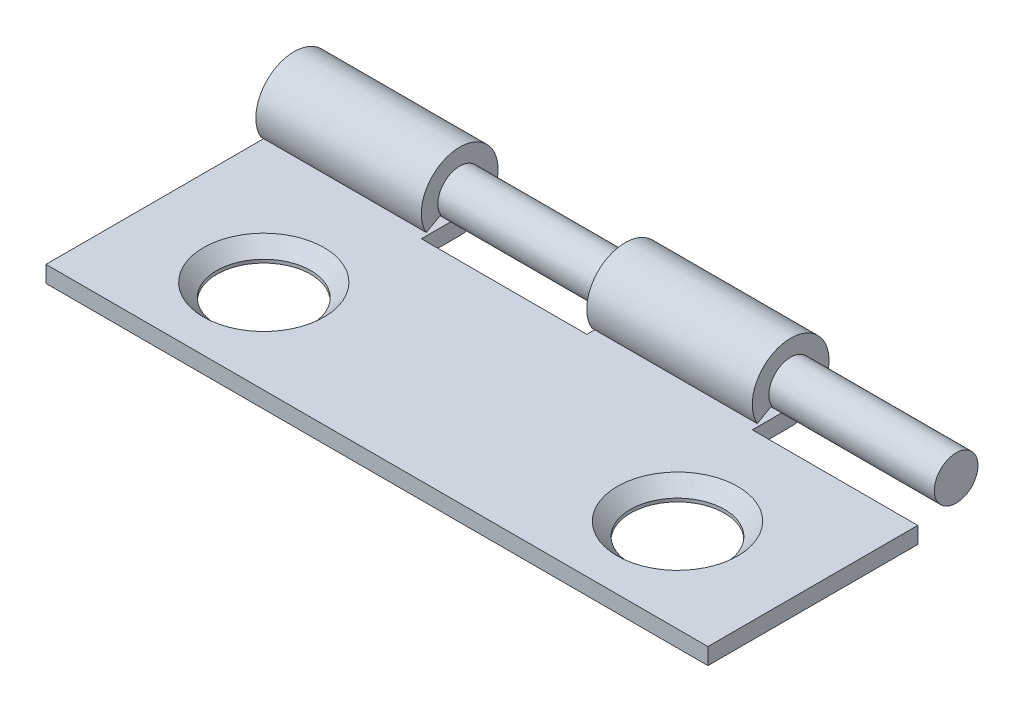
ISO-10303-21;
HEADER;
FILE_DESCRIPTION(('STEP AP214'),'2;1');
FILE_NAME('part.step','',(''),(''),'','','');
FILE_SCHEMA(('AUTOMOTIVE_DESIGN { 1 0 10303 214 1 1 1 1 }'));
ENDSEC;
DATA;
#1=APPLICATION_CONTEXT('core data for automotive mechanical design processes');
#2=APPLICATION_PROTOCOL_DEFINITION('international standard','automotive_design',2000,#1);
#3=PRODUCT_CONTEXT('',#1,'mechanical');
#4=PRODUCT('Part','Part','',(#3));
#5=PRODUCT_RELATED_PRODUCT_CATEGORY('part','',(#4));
#6=PRODUCT_DEFINITION_FORMATION('','',#4);
#7=PRODUCT_DEFINITION_CONTEXT('part definition',#1,'design');
#8=PRODUCT_DEFINITION('design','',#6,#7);
#9=PRODUCT_DEFINITION_SHAPE('','',#8);
#10=(LENGTH_UNIT() NAMED_UNIT(*) SI_UNIT(.MILLI.,.METRE.));
#11=(NAMED_UNIT(*) PLANE_ANGLE_UNIT() SI_UNIT($,.RADIAN.));
#12=(NAMED_UNIT(*) SI_UNIT($,.STERADIAN.) SOLID_ANGLE_UNIT());
#13=UNCERTAINTY_MEASURE_WITH_UNIT(LENGTH_MEASURE(1.E-05),#10,'distance_accuracy_value','');
#14=(GEOMETRIC_REPRESENTATION_CONTEXT(3) GLOBAL_UNCERTAINTY_ASSIGNED_CONTEXT((#13)) GLOBAL_UNIT_ASSIGNED_CONTEXT((#10,
#11,#12)) REPRESENTATION_CONTEXT('',''));
#15=CARTESIAN_POINT('',(0.,0.,0.));
#16=DIRECTION('',(0.,0.,1.));
#17=DIRECTION('',(1.,0.,0.));
#18=AXIS2_PLACEMENT_3D('',#15,#16,#17);
#19=CARTESIAN_POINT('',(12.7,0.,0.));
#20=DIRECTION('',(-1.,0.,0.));
#21=DIRECTION('',(0.,0.,1.));
#22=AXIS2_PLACEMENT_3D('',#19,#20,#21);
#23=CYLINDRICAL_SURFACE('',#22,0.8382);
#24=CARTESIAN_POINT('',(12.7,0.,0.));
#25=DIRECTION('',(1.,0.,0.));
#26=DIRECTION('',(0.,0.,-1.));
#27=AXIS2_PLACEMENT_3D('',#24,#25,#26);
#28=CIRCLE('',#27,0.8382);
#29=CARTESIAN_POINT('',(12.7,0.,-0.8382));
#30=VERTEX_POINT('',#29);
#31=EDGE_CURVE('E11',#30,#30,#28,.T.);
#32=ORIENTED_EDGE('',*,*,#31,.F.);
#33=EDGE_LOOP('',(#32));
#34=FACE_BOUND('',#33,.T.);
#35=CARTESIAN_POINT('',(-12.7,0.,0.));
#36=DIRECTION('',(1.,0.,0.));
#37=DIRECTION('',(0.,0.,-1.));
#38=AXIS2_PLACEMENT_3D('',#35,#36,#37);
#39=CIRCLE('',#38,0.8382);
#40=CARTESIAN_POINT('',(-12.7,0.,-0.8382));
#41=VERTEX_POINT('',#40);
#42=EDGE_CURVE('E49',#41,#41,#39,.T.);
#43=ORIENTED_EDGE('',*,*,#42,.T.);
#44=EDGE_LOOP('',(#43));
#45=FACE_BOUND('',#44,.T.);
#46=ADVANCED_FACE('F46',(#34,#45),#23,.T.);
#47=CARTESIAN_POINT('',(12.7,0.,0.));
#48=DIRECTION('',(1.,0.,0.));
#49=DIRECTION('',(0.,0.,-1.));
#50=AXIS2_PLACEMENT_3D('',#47,#48,#49);
#51=PLANE('',#50);
#52=ORIENTED_EDGE('',*,*,#31,.T.);
#53=EDGE_LOOP('',(#52));
#54=FACE_BOUND('',#53,.T.);
#55=ADVANCED_FACE('F61',(#54),#51,.T.);
#56=CARTESIAN_POINT('',(-12.7,0.,0.));
#57=DIRECTION('',(1.,0.,0.));
#58=DIRECTION('',(0.,0.,-1.));
#59=AXIS2_PLACEMENT_3D('',#56,#57,#58);
#60=PLANE('',#59);
#61=ORIENTED_EDGE('',*,*,#42,.F.);
#62=EDGE_LOOP('',(#61));
#63=FACE_BOUND('',#62,.T.);
#64=ADVANCED_FACE('F59',(#63),#60,.F.);
#65=CLOSED_SHELL('',(#46,#55,#64));
#66=MANIFOLD_SOLID_BREP('B2',#65);
#67=CARTESIAN_POINT('',(12.7,0.,0.));
#68=DIRECTION('',(-1.,0.,0.));
#69=DIRECTION('',(0.,0.,1.));
#70=AXIS2_PLACEMENT_3D('',#67,#68,#69);
#71=CYLINDRICAL_SURFACE('',#70,1.47320000000008);
#72=CARTESIAN_POINT('',(6.35,0.,0.));
#73=DIRECTION('',(-1.,0.,0.));
#74=DIRECTION('',(0.,0.,1.));
#75=AXIS2_PLACEMENT_3D('',#72,#73,#74);
#76=CIRCLE('',#75,1.47320000000008);
#77=CARTESIAN_POINT('',(6.35,-0.728533124002553,1.28045215733782));
#78=VERTEX_POINT('',#77);
#79=CARTESIAN_POINT('',(6.35,-1.4732,0.));
#80=VERTEX_POINT('',#79);
#81=EDGE_CURVE('E225',#78,#80,#76,.T.);
#82=ORIENTED_EDGE('',*,*,#81,.T.);
#83=DIRECTION('',(-1.,0.,0.));
#84=VECTOR('',#83,1.);
#85=CARTESIAN_POINT('',(12.7,-1.4732,0.));
#86=LINE('',#85,#84);
#87=CARTESIAN_POINT('',(0.,-1.4732,0.));
#88=VERTEX_POINT('',#87);
#89=EDGE_CURVE('E208',#80,#88,#86,.T.);
#90=ORIENTED_EDGE('',*,*,#89,.T.);
#91=CARTESIAN_POINT('',(0.,0.,0.));
#92=DIRECTION('',(1.,0.,0.));
#93=DIRECTION('',(0.,0.,-1.));
#94=AXIS2_PLACEMENT_3D('',#91,#92,#93);
#95=CIRCLE('',#94,1.47320000000008);
#96=CARTESIAN_POINT('',(0.,-0.728533124002553,1.28045215733782));
#97=VERTEX_POINT('',#96);
#98=EDGE_CURVE('E249',#88,#97,#95,.T.);
#99=ORIENTED_EDGE('',*,*,#98,.T.);
#100=DIRECTION('',(-1.,0.,0.));
#101=VECTOR('',#100,1.);
#102=CARTESIAN_POINT('',(12.7,-0.728533124002553,1.28045215733782));
#103=LINE('',#102,#101);
#104=EDGE_CURVE('E286',#78,#97,#103,.T.);
#105=ORIENTED_EDGE('',*,*,#104,.F.);
#106=EDGE_LOOP('',(#82,#90,#99,#105));
#107=FACE_BOUND('',#106,.T.);
#108=ADVANCED_FACE('F86',(#107),#71,.T.);
#109=CARTESIAN_POINT('',(12.7,0.,0.));
#110=DIRECTION('',(-1.,0.,0.));
#111=DIRECTION('',(0.,0.,1.));
#112=AXIS2_PLACEMENT_3D('',#109,#110,#111);
#113=CYLINDRICAL_SURFACE('',#112,0.8382);
#114=DIRECTION('',(-1.,0.,0.));
#115=VECTOR('',#114,1.);
#116=CARTESIAN_POINT('',(12.7,-0.8382,0.));
#117=LINE('',#116,#115);
#118=CARTESIAN_POINT('',(6.35,-0.8382,0.));
#119=VERTEX_POINT('',#118);
#120=CARTESIAN_POINT('',(0.,-0.8382,0.));
#121=VERTEX_POINT('',#120);
#122=EDGE_CURVE('E297',#119,#121,#117,.T.);
#123=ORIENTED_EDGE('',*,*,#122,.F.);
#124=CARTESIAN_POINT('',(6.35,0.,0.));
#125=DIRECTION('',(-1.,0.,0.));
#126=DIRECTION('',(0.,0.,1.));
#127=AXIS2_PLACEMENT_3D('',#124,#125,#126);
#128=CIRCLE('',#127,0.8382);
#129=CARTESIAN_POINT('',(6.35,-0.414510225725591,0.728533124002553));
#130=VERTEX_POINT('',#129);
#131=EDGE_CURVE('E219',#119,#130,#128,.F.);
#132=ORIENTED_EDGE('',*,*,#131,.T.);
#133=DIRECTION('',(-1.,0.,0.));
#134=VECTOR('',#133,1.);
#135=CARTESIAN_POINT('',(12.7,-0.414510225725591,0.728533124002553));
#136=LINE('',#135,#134);
#137=CARTESIAN_POINT('',(0.,-0.414510225725591,0.728533124002553));
#138=VERTEX_POINT('',#137);
#139=EDGE_CURVE('E283',#130,#138,#136,.T.);
#140=ORIENTED_EDGE('',*,*,#139,.T.);
#141=CARTESIAN_POINT('',(0.,0.,0.));
#142=DIRECTION('',(1.,0.,0.));
#143=DIRECTION('',(0.,0.,-1.));
#144=AXIS2_PLACEMENT_3D('',#141,#142,#143);
#145=CIRCLE('',#144,0.8382);
#146=EDGE_CURVE('E248',#138,#121,#145,.F.);
#147=ORIENTED_EDGE('',*,*,#146,.T.);
#148=EDGE_LOOP('',(#123,#132,#140,#147));
#149=FACE_BOUND('',#148,.T.);
#150=ADVANCED_FACE('F372',(#149),#113,.F.);
#151=CARTESIAN_POINT('',(12.7,-0.414510225725591,0.728533124002553));
#152=DIRECTION('',(0.,0.869163832024044,0.494524249255059));
#153=DIRECTION('',(0.,-0.494524249255059,0.869163832024044));
#154=AXIS2_PLACEMENT_3D('',#151,#152,#153);
#155=PLANE('',#154);
#156=ORIENTED_EDGE('',*,*,#139,.F.);
#157=DIRECTION('',(0.,-0.49452424925506,0.869163832024044));
#158=VECTOR('',#157,1.);
#159=CARTESIAN_POINT('',(6.35,-0.414510225725592,0.728533124002555));
#160=LINE('',#159,#158);
#161=EDGE_CURVE('E222',#130,#78,#160,.T.);
#162=ORIENTED_EDGE('',*,*,#161,.T.);
#163=ORIENTED_EDGE('',*,*,#104,.T.);
#164=DIRECTION('',(0.,0.49452424925506,-0.869163832024044));
#165=VECTOR('',#164,1.);
#166=CARTESIAN_POINT('',(0.,-0.414510225725592,0.728533124002556));
#167=LINE('',#166,#165);
#168=EDGE_CURVE('E44',#97,#138,#167,.T.);
#169=ORIENTED_EDGE('',*,*,#168,.T.);
#170=EDGE_LOOP('',(#156,#162,#163,#169));
#171=FACE_BOUND('',#170,.T.);
#172=ADVANCED_FACE('F369',(#171),#155,.F.);
#173=CARTESIAN_POINT('',(-6.35,-0.8382,0.));
#174=VERTEX_POINT('',#173);
#175=CARTESIAN_POINT('',(-12.7,-0.8382,0.));
#176=VERTEX_POINT('',#175);
#177=EDGE_CURVE('E296',#174,#176,#117,.T.);
#178=ORIENTED_EDGE('',*,*,#177,.F.);
#179=CARTESIAN_POINT('',(-6.35,0.,0.));
#180=DIRECTION('',(-1.,0.,0.));
#181=DIRECTION('',(0.,0.,1.));
#182=AXIS2_PLACEMENT_3D('',#179,#180,#181);
#183=CIRCLE('',#182,0.8382);
#184=CARTESIAN_POINT('',(-6.35,-0.414510225725591,0.728533124002553));
#185=VERTEX_POINT('',#184);
#186=EDGE_CURVE('E239',#174,#185,#183,.F.);
#187=ORIENTED_EDGE('',*,*,#186,.T.);
#188=CARTESIAN_POINT('',(-12.7,-0.414510225725591,0.728533124002553));
#189=VERTEX_POINT('',#188);
#190=EDGE_CURVE('E268',#185,#189,#136,.T.);
#191=ORIENTED_EDGE('',*,*,#190,.T.);
#192=CARTESIAN_POINT('',(-12.7,0.,0.));
#193=DIRECTION('',(-1.,0.,0.));
#194=DIRECTION('',(0.,0.,1.));
#195=AXIS2_PLACEMENT_3D('',#192,#193,#194);
#196=CIRCLE('',#195,0.8382);
#197=EDGE_CURVE('E260',#189,#176,#196,.T.);
#198=ORIENTED_EDGE('',*,*,#197,.T.);
#199=EDGE_LOOP('',(#178,#187,#191,#198));
#200=FACE_BOUND('',#199,.T.);
#201=ADVANCED_FACE('F88',(#200),#113,.F.);
#202=CARTESIAN_POINT('',(12.7,-0.8382,9.525));
#203=DIRECTION('',(0.,-1.,0.));
#204=DIRECTION('',(0.,0.,-1.));
#205=AXIS2_PLACEMENT_3D('',#202,#203,#204);
#206=PLANE('',#205);
#207=CARTESIAN_POINT('',(7.9502,-0.8382,5.9436));
#208=DIRECTION('',(0.,1.,0.));
#209=DIRECTION('',(0.,0.,1.));
#210=AXIS2_PLACEMENT_3D('',#207,#208,#209);
#211=CIRCLE('',#210,2.3114);
#212=CARTESIAN_POINT('',(7.9502,-0.8382,8.255));
#213=VERTEX_POINT('',#212);
#214=EDGE_CURVE('E209',#213,#213,#211,.T.);
#215=ORIENTED_EDGE('',*,*,#214,.F.);
#216=EDGE_LOOP('',(#215));
#217=FACE_BOUND('',#216,.T.);
#218=CARTESIAN_POINT('',(-7.9248,-0.8382,5.9436));
#219=DIRECTION('',(0.,1.,0.));
#220=DIRECTION('',(0.,0.,1.));
#221=AXIS2_PLACEMENT_3D('',#218,#219,#220);
#222=CIRCLE('',#221,2.3114);
#223=CARTESIAN_POINT('',(-7.9248,-0.8382,8.255));
#224=VERTEX_POINT('',#223);
#225=EDGE_CURVE('E212',#224,#224,#222,.T.);
#226=ORIENTED_EDGE('',*,*,#225,.F.);
#227=EDGE_LOOP('',(#226));
#228=FACE_BOUND('',#227,.T.);
#229=DIRECTION('',(0.,0.,1.));
#230=VECTOR('',#229,1.);
#231=CARTESIAN_POINT('',(12.7,-0.8382,9.525));
#232=LINE('',#231,#230);
#233=CARTESIAN_POINT('',(12.7,-0.8382,1.47320000000013));
#234=VERTEX_POINT('',#233);
#235=CARTESIAN_POINT('',(12.7,-0.8382,9.525));
#236=VERTEX_POINT('',#235);
#237=EDGE_CURVE('E261',#234,#236,#232,.T.);
#238=ORIENTED_EDGE('',*,*,#237,.F.);
#239=DIRECTION('',(-1.,0.,0.));
#240=VECTOR('',#239,1.);
#241=CARTESIAN_POINT('',(12.7,-0.8382,1.47320000000012));
#242=LINE('',#241,#240);
#243=CARTESIAN_POINT('',(6.35,-0.8382,1.47320000000012));
#244=VERTEX_POINT('',#243);
#245=EDGE_CURVE('E103',#234,#244,#242,.T.);
#246=ORIENTED_EDGE('',*,*,#245,.T.);
#247=DIRECTION('',(0.,0.,-1.));
#248=VECTOR('',#247,1.);
#249=CARTESIAN_POINT('',(6.35,-0.8382,9.525));
#250=LINE('',#249,#248);
#251=EDGE_CURVE('E196',#244,#119,#250,.T.);
#252=ORIENTED_EDGE('',*,*,#251,.T.);
#253=ORIENTED_EDGE('',*,*,#122,.T.);
#254=DIRECTION('',(0.,0.,1.));
#255=VECTOR('',#254,1.);
#256=CARTESIAN_POINT('',(0.,-0.8382,9.525));
#257=LINE('',#256,#255);
#258=CARTESIAN_POINT('',(0.,-0.8382,1.47320000000012));
#259=VERTEX_POINT('',#258);
#260=EDGE_CURVE('E252',#121,#259,#257,.T.);
#261=ORIENTED_EDGE('',*,*,#260,.T.);
#262=DIRECTION('',(-1.,0.,0.));
#263=VECTOR('',#262,1.);
#264=CARTESIAN_POINT('',(12.7,-0.8382,1.47320000000012));
#265=LINE('',#264,#263);
#266=CARTESIAN_POINT('',(-6.35,-0.8382,1.47320000000012));
#267=VERTEX_POINT('',#266);
#268=EDGE_CURVE('E257',#259,#267,#265,.T.);
#269=ORIENTED_EDGE('',*,*,#268,.T.);
#270=DIRECTION('',(0.,0.,-1.));
#271=VECTOR('',#270,1.);
#272=CARTESIAN_POINT('',(-6.34999999999999,-0.8382,9.52500000000001));
#273=LINE('',#272,#271);
#274=EDGE_CURVE('E243',#267,#174,#273,.T.);
#275=ORIENTED_EDGE('',*,*,#274,.T.);
#276=ORIENTED_EDGE('',*,*,#177,.T.);
#277=DIRECTION('',(0.,0.,1.));
#278=VECTOR('',#277,1.);
#279=CARTESIAN_POINT('',(-12.7,-0.8382,9.525));
#280=LINE('',#279,#278);
#281=CARTESIAN_POINT('',(-12.7,-0.8382,9.525));
#282=VERTEX_POINT('',#281);
#283=EDGE_CURVE('E271',#176,#282,#280,.T.);
#284=ORIENTED_EDGE('',*,*,#283,.T.);
#285=DIRECTION('',(-1.,0.,0.));
#286=VECTOR('',#285,1.);
#287=CARTESIAN_POINT('',(12.7,-0.8382,9.525));
#288=LINE('',#287,#286);
#289=EDGE_CURVE('E293',#236,#282,#288,.T.);
#290=ORIENTED_EDGE('',*,*,#289,.F.);
#291=EDGE_LOOP('',(#238,#246,#252,#253,#261,#269,#275,#276,#284,#290));
#292=FACE_BOUND('',#291,.T.);
#293=ADVANCED_FACE('F330',(#217,#228,#292),#206,.F.);
#294=CARTESIAN_POINT('',(12.7,-1.4732,9.525));
#295=DIRECTION('',(0.,0.,-1.));
#296=DIRECTION('',(-1.,0.,0.));
#297=AXIS2_PLACEMENT_3D('',#294,#295,#296);
#298=PLANE('',#297);
#299=DIRECTION('',(0.,-1.,0.));
#300=VECTOR('',#299,1.);
#301=CARTESIAN_POINT('',(-12.7,-1.4732,9.525));
#302=LINE('',#301,#300);
#303=CARTESIAN_POINT('',(-12.7,-1.4732,9.525));
#304=VERTEX_POINT('',#303);
#305=EDGE_CURVE('E273',#282,#304,#302,.T.);
#306=ORIENTED_EDGE('',*,*,#305,.T.);
#307=DIRECTION('',(-1.,0.,0.));
#308=VECTOR('',#307,1.);
#309=CARTESIAN_POINT('',(12.7,-1.4732,9.525));
#310=LINE('',#309,#308);
#311=CARTESIAN_POINT('',(12.7,-1.4732,9.525));
#312=VERTEX_POINT('',#311);
#313=EDGE_CURVE('E290',#312,#304,#310,.T.);
#314=ORIENTED_EDGE('',*,*,#313,.F.);
#315=DIRECTION('',(0.,-1.,0.));
#316=VECTOR('',#315,1.);
#317=CARTESIAN_POINT('',(12.7,-1.4732,9.525));
#318=LINE('',#317,#316);
#319=EDGE_CURVE('E263',#236,#312,#318,.T.);
#320=ORIENTED_EDGE('',*,*,#319,.F.);
#321=ORIENTED_EDGE('',*,*,#289,.T.);
#322=EDGE_LOOP('',(#306,#314,#320,#321));
#323=FACE_BOUND('',#322,.T.);
#324=ADVANCED_FACE('F333',(#323),#298,.F.);
#325=CARTESIAN_POINT('',(12.7,-1.4732,0.));
#326=DIRECTION('',(0.,1.,0.));
#327=DIRECTION('',(0.,0.,1.));
#328=AXIS2_PLACEMENT_3D('',#325,#326,#327);
#329=PLANE('',#328);
#330=CARTESIAN_POINT('',(7.9502,-1.4732,5.9436));
#331=DIRECTION('',(0.,1.,0.));
#332=DIRECTION('',(0.,0.,1.));
#333=AXIS2_PLACEMENT_3D('',#330,#331,#332);
#334=CIRCLE('',#333,1.8034);
#335=CARTESIAN_POINT('',(7.9502,-1.4732,7.747));
#336=VERTEX_POINT('',#335);
#337=EDGE_CURVE('E301',#336,#336,#334,.T.);
#338=ORIENTED_EDGE('',*,*,#337,.T.);
#339=EDGE_LOOP('',(#338));
#340=FACE_BOUND('',#339,.T.);
#341=CARTESIAN_POINT('',(-7.9248,-1.4732,5.9436));
#342=DIRECTION('',(0.,1.,0.));
#343=DIRECTION('',(0.,0.,1.));
#344=AXIS2_PLACEMENT_3D('',#341,#342,#343);
#345=CIRCLE('',#344,1.8034);
#346=CARTESIAN_POINT('',(-7.9248,-1.4732,7.747));
#347=VERTEX_POINT('',#346);
#348=EDGE_CURVE('E306',#347,#347,#345,.T.);
#349=ORIENTED_EDGE('',*,*,#348,.T.);
#350=EDGE_LOOP('',(#349));
#351=FACE_BOUND('',#350,.T.);
#352=DIRECTION('',(0.,0.,1.));
#353=VECTOR('',#352,1.);
#354=CARTESIAN_POINT('',(6.35,-1.4732,1.47320000000012));
#355=LINE('',#354,#353);
#356=CARTESIAN_POINT('',(6.35,-1.4732,1.47320000000012));
#357=VERTEX_POINT('',#356);
#358=EDGE_CURVE('E193',#80,#357,#355,.T.);
#359=ORIENTED_EDGE('',*,*,#358,.T.);
#360=DIRECTION('',(1.,0.,0.));
#361=VECTOR('',#360,1.);
#362=CARTESIAN_POINT('',(12.7,-1.4732,1.47320000000012));
#363=LINE('',#362,#361);
#364=CARTESIAN_POINT('',(12.7,-1.4732,1.47320000000012));
#365=VERTEX_POINT('',#364);
#366=EDGE_CURVE('E198',#357,#365,#363,.T.);
#367=ORIENTED_EDGE('',*,*,#366,.T.);
#368=DIRECTION('',(0.,0.,-1.));
#369=VECTOR('',#368,1.);
#370=CARTESIAN_POINT('',(12.7,-1.4732,0.));
#371=LINE('',#370,#369);
#372=EDGE_CURVE('E266',#312,#365,#371,.T.);
#373=ORIENTED_EDGE('',*,*,#372,.F.);
#374=ORIENTED_EDGE('',*,*,#313,.T.);
#375=DIRECTION('',(0.,0.,-1.));
#376=VECTOR('',#375,1.);
#377=CARTESIAN_POINT('',(-12.7,-1.4732,0.));
#378=LINE('',#377,#376);
#379=CARTESIAN_POINT('',(-12.7,-1.4732,0.));
#380=VERTEX_POINT('',#379);
#381=EDGE_CURVE('E275',#304,#380,#378,.T.);
#382=ORIENTED_EDGE('',*,*,#381,.T.);
#383=CARTESIAN_POINT('',(-6.35,-1.4732,0.));
#384=VERTEX_POINT('',#383);
#385=EDGE_CURVE('E288',#384,#380,#86,.T.);
#386=ORIENTED_EDGE('',*,*,#385,.F.);
#387=DIRECTION('',(0.,0.,1.));
#388=VECTOR('',#387,1.);
#389=CARTESIAN_POINT('',(-6.35,-1.4732,1.47320000000012));
#390=LINE('',#389,#388);
#391=CARTESIAN_POINT('',(-6.35,-1.4732,1.47320000000012));
#392=VERTEX_POINT('',#391);
#393=EDGE_CURVE('E229',#384,#392,#390,.T.);
#394=ORIENTED_EDGE('',*,*,#393,.T.);
#395=DIRECTION('',(1.,0.,0.));
#396=VECTOR('',#395,1.);
#397=CARTESIAN_POINT('',(0.,-1.4732,1.47320000000012));
#398=LINE('',#397,#396);
#399=CARTESIAN_POINT('',(0.,-1.4732,1.47320000000012));
#400=VERTEX_POINT('',#399);
#401=EDGE_CURVE('E232',#392,#400,#398,.T.);
#402=ORIENTED_EDGE('',*,*,#401,.T.);
#403=DIRECTION('',(0.,0.,-1.));
#404=VECTOR('',#403,1.);
#405=CARTESIAN_POINT('',(0.,-1.4732,-1.47320000000013));
#406=LINE('',#405,#404);
#407=EDGE_CURVE('E227',#400,#88,#406,.T.);
#408=ORIENTED_EDGE('',*,*,#407,.T.);
#409=ORIENTED_EDGE('',*,*,#89,.F.);
#410=EDGE_LOOP('',(#359,#367,#373,#374,#382,#386,#394,#402,#408,#409));
#411=FACE_BOUND('',#410,.T.);
#412=ADVANCED_FACE('F206',(#340,#351,#411),#329,.F.);
#413=CARTESIAN_POINT('',(-6.35,-0.728533124002553,1.28045215733782));
#414=VERTEX_POINT('',#413);
#415=CARTESIAN_POINT('',(-12.7,-0.728533124002553,1.28045215733782));
#416=VERTEX_POINT('',#415);
#417=EDGE_CURVE('E285',#414,#416,#103,.T.);
#418=ORIENTED_EDGE('',*,*,#417,.F.);
#419=CARTESIAN_POINT('',(-6.35,0.,0.));
#420=DIRECTION('',(-1.,0.,0.));
#421=DIRECTION('',(0.,0.,1.));
#422=AXIS2_PLACEMENT_3D('',#419,#420,#421);
#423=CIRCLE('',#422,1.47320000000008);
#424=EDGE_CURVE('E111',#414,#384,#423,.T.);
#425=ORIENTED_EDGE('',*,*,#424,.T.);
#426=ORIENTED_EDGE('',*,*,#385,.T.);
#427=CARTESIAN_POINT('',(-12.7,0.,0.));
#428=DIRECTION('',(1.,0.,0.));
#429=DIRECTION('',(0.,0.,1.));
#430=AXIS2_PLACEMENT_3D('',#427,#428,#429);
#431=CIRCLE('',#430,1.47320000000008);
#432=EDGE_CURVE('E278',#380,#416,#431,.T.);
#433=ORIENTED_EDGE('',*,*,#432,.T.);
#434=EDGE_LOOP('',(#418,#425,#426,#433));
#435=FACE_BOUND('',#434,.T.);
#436=ADVANCED_FACE('F353',(#435),#71,.T.);
#437=ORIENTED_EDGE('',*,*,#190,.F.);
#438=DIRECTION('',(0.,-0.49452424925506,0.869163832024044));
#439=VECTOR('',#438,1.);
#440=CARTESIAN_POINT('',(-6.35,-0.414510225725593,0.728533124002557));
#441=LINE('',#440,#439);
#442=EDGE_CURVE('E95',#185,#414,#441,.T.);
#443=ORIENTED_EDGE('',*,*,#442,.T.);
#444=ORIENTED_EDGE('',*,*,#417,.T.);
#445=DIRECTION('',(0.,0.494524249255059,-0.869163832024044));
#446=VECTOR('',#445,1.);
#447=CARTESIAN_POINT('',(-12.7,-0.414510225725591,0.728533124002553));
#448=LINE('',#447,#446);
#449=EDGE_CURVE('E264',#416,#189,#448,.T.);
#450=ORIENTED_EDGE('',*,*,#449,.T.);
#451=EDGE_LOOP('',(#437,#443,#444,#450));
#452=FACE_BOUND('',#451,.T.);
#453=ADVANCED_FACE('F389',(#452),#155,.F.);
#454=CARTESIAN_POINT('',(12.7,0.,0.));
#455=DIRECTION('',(-1.,0.,0.));
#456=DIRECTION('',(0.,0.,1.));
#457=AXIS2_PLACEMENT_3D('',#454,#455,#456);
#458=PLANE('',#457);
#459=ORIENTED_EDGE('',*,*,#372,.T.);
#460=DIRECTION('',(0.,1.,0.));
#461=VECTOR('',#460,1.);
#462=CARTESIAN_POINT('',(12.7,-1.4732,1.47320000000012));
#463=LINE('',#462,#461);
#464=EDGE_CURVE('E197',#365,#234,#463,.T.);
#465=ORIENTED_EDGE('',*,*,#464,.T.);
#466=ORIENTED_EDGE('',*,*,#237,.T.);
#467=ORIENTED_EDGE('',*,*,#319,.T.);
#468=EDGE_LOOP('',(#459,#465,#466,#467));
#469=FACE_BOUND('',#468,.T.);
#470=ADVANCED_FACE('F339',(#469),#458,.F.);
#471=CARTESIAN_POINT('',(-12.7,0.,0.));
#472=DIRECTION('',(-1.,0.,0.));
#473=DIRECTION('',(0.,0.,1.));
#474=AXIS2_PLACEMENT_3D('',#471,#472,#473);
#475=PLANE('',#474);
#476=ORIENTED_EDGE('',*,*,#197,.F.);
#477=ORIENTED_EDGE('',*,*,#449,.F.);
#478=ORIENTED_EDGE('',*,*,#432,.F.);
#479=ORIENTED_EDGE('',*,*,#381,.F.);
#480=ORIENTED_EDGE('',*,*,#305,.F.);
#481=ORIENTED_EDGE('',*,*,#283,.F.);
#482=EDGE_LOOP('',(#476,#477,#478,#479,#480,#481));
#483=FACE_BOUND('',#482,.T.);
#484=ADVANCED_FACE('F348',(#483),#475,.T.);
#485=CARTESIAN_POINT('',(0.,-1.4732,1.47320000000012));
#486=DIRECTION('',(0.,0.,1.));
#487=DIRECTION('',(1.,0.,0.));
#488=AXIS2_PLACEMENT_3D('',#485,#486,#487);
#489=PLANE('',#488);
#490=DIRECTION('',(0.,1.,0.));
#491=VECTOR('',#490,1.);
#492=CARTESIAN_POINT('',(0.,-1.4732,1.47320000000012));
#493=LINE('',#492,#491);
#494=EDGE_CURVE('E236',#400,#259,#493,.T.);
#495=ORIENTED_EDGE('',*,*,#494,.F.);
#496=ORIENTED_EDGE('',*,*,#401,.F.);
#497=DIRECTION('',(0.,1.,0.));
#498=VECTOR('',#497,1.);
#499=CARTESIAN_POINT('',(-6.35,-1.4732,1.47320000000012));
#500=LINE('',#499,#498);
#501=EDGE_CURVE('E235',#392,#267,#500,.T.);
#502=ORIENTED_EDGE('',*,*,#501,.T.);
#503=ORIENTED_EDGE('',*,*,#268,.F.);
#504=EDGE_LOOP('',(#495,#496,#502,#503));
#505=FACE_BOUND('',#504,.T.);
#506=ADVANCED_FACE('F357',(#505),#489,.F.);
#507=CARTESIAN_POINT('',(0.,-1.4732,-1.47320000000013));
#508=DIRECTION('',(1.,0.,0.));
#509=DIRECTION('',(0.,0.,-1.));
#510=AXIS2_PLACEMENT_3D('',#507,#508,#509);
#511=PLANE('',#510);
#512=ORIENTED_EDGE('',*,*,#146,.F.);
#513=ORIENTED_EDGE('',*,*,#168,.F.);
#514=ORIENTED_EDGE('',*,*,#98,.F.);
#515=ORIENTED_EDGE('',*,*,#407,.F.);
#516=ORIENTED_EDGE('',*,*,#494,.T.);
#517=ORIENTED_EDGE('',*,*,#260,.F.);
#518=EDGE_LOOP('',(#512,#513,#514,#515,#516,#517));
#519=FACE_BOUND('',#518,.T.);
#520=ADVANCED_FACE('F363',(#519),#511,.F.);
#521=CARTESIAN_POINT('',(-6.35,-1.4732,1.47320000000012));
#522=DIRECTION('',(-1.,0.,0.));
#523=DIRECTION('',(0.,0.,1.));
#524=AXIS2_PLACEMENT_3D('',#521,#522,#523);
#525=PLANE('',#524);
#526=ORIENTED_EDGE('',*,*,#424,.F.);
#527=ORIENTED_EDGE('',*,*,#442,.F.);
#528=ORIENTED_EDGE('',*,*,#186,.F.);
#529=ORIENTED_EDGE('',*,*,#274,.F.);
#530=ORIENTED_EDGE('',*,*,#501,.F.);
#531=ORIENTED_EDGE('',*,*,#393,.F.);
#532=EDGE_LOOP('',(#526,#527,#528,#529,#530,#531));
#533=FACE_BOUND('',#532,.T.);
#534=ADVANCED_FACE('F355',(#533),#525,.F.);
#535=CARTESIAN_POINT('',(6.35,-1.4732,1.47320000000012));
#536=DIRECTION('',(-1.,0.,0.));
#537=DIRECTION('',(0.,0.,1.));
#538=AXIS2_PLACEMENT_3D('',#535,#536,#537);
#539=PLANE('',#538);
#540=ORIENTED_EDGE('',*,*,#81,.F.);
#541=ORIENTED_EDGE('',*,*,#161,.F.);
#542=ORIENTED_EDGE('',*,*,#131,.F.);
#543=ORIENTED_EDGE('',*,*,#251,.F.);
#544=DIRECTION('',(0.,1.,0.));
#545=VECTOR('',#544,1.);
#546=CARTESIAN_POINT('',(6.35,-1.4732,1.47320000000012));
#547=LINE('',#546,#545);
#548=EDGE_CURVE('E189',#357,#244,#547,.T.);
#549=ORIENTED_EDGE('',*,*,#548,.F.);
#550=ORIENTED_EDGE('',*,*,#358,.F.);
#551=EDGE_LOOP('',(#540,#541,#542,#543,#549,#550));
#552=FACE_BOUND('',#551,.T.);
#553=ADVANCED_FACE('F191',(#552),#539,.F.);
#554=CARTESIAN_POINT('',(12.7,-1.4732,1.47320000000012));
#555=DIRECTION('',(0.,0.,1.));
#556=DIRECTION('',(1.,0.,0.));
#557=AXIS2_PLACEMENT_3D('',#554,#555,#556);
#558=PLANE('',#557);
#559=ORIENTED_EDGE('',*,*,#464,.F.);
#560=ORIENTED_EDGE('',*,*,#366,.F.);
#561=ORIENTED_EDGE('',*,*,#548,.T.);
#562=ORIENTED_EDGE('',*,*,#245,.F.);
#563=EDGE_LOOP('',(#559,#560,#561,#562));
#564=FACE_BOUND('',#563,.T.);
#565=ADVANCED_FACE('F201',(#564),#558,.F.);
#566=CARTESIAN_POINT('',(-7.9248,-0.8382,5.9436));
#567=DIRECTION('',(0.,1.,0.));
#568=DIRECTION('',(0.,0.,1.));
#569=AXIS2_PLACEMENT_3D('',#566,#567,#568);
#570=CONICAL_SURFACE('',#569,2.3114,0.78539816339745);
#571=CARTESIAN_POINT('',(-7.9248,-1.3462,5.9436));
#572=DIRECTION('',(0.,1.,0.));
#573=DIRECTION('',(0.,0.,1.));
#574=AXIS2_PLACEMENT_3D('',#571,#572,#573);
#575=CIRCLE('',#574,1.8034);
#576=CARTESIAN_POINT('',(-7.9248,-1.3462,7.747));
#577=VERTEX_POINT('',#576);
#578=EDGE_CURVE('E90',#577,#577,#575,.F.);
#579=ORIENTED_EDGE('',*,*,#578,.T.);
#580=EDGE_LOOP('',(#579));
#581=FACE_BOUND('',#580,.T.);
#582=ORIENTED_EDGE('',*,*,#225,.T.);
#583=EDGE_LOOP('',(#582));
#584=FACE_BOUND('',#583,.T.);
#585=ADVANCED_FACE('F322',(#581,#584),#570,.F.);
#586=CARTESIAN_POINT('',(7.9502,-0.8382,5.9436));
#587=DIRECTION('',(0.,1.,0.));
#588=DIRECTION('',(0.,0.,1.));
#589=AXIS2_PLACEMENT_3D('',#586,#587,#588);
#590=CONICAL_SURFACE('',#589,2.3114,0.78539816339745);
#591=CARTESIAN_POINT('',(7.9502,-1.3462,5.9436));
#592=DIRECTION('',(0.,1.,0.));
#593=DIRECTION('',(0.,0.,1.));
#594=AXIS2_PLACEMENT_3D('',#591,#592,#593);
#595=CIRCLE('',#594,1.8034);
#596=CARTESIAN_POINT('',(7.9502,-1.3462,7.747));
#597=VERTEX_POINT('',#596);
#598=EDGE_CURVE('E299',#597,#597,#595,.F.);
#599=ORIENTED_EDGE('',*,*,#598,.T.);
#600=EDGE_LOOP('',(#599));
#601=FACE_BOUND('',#600,.T.);
#602=ORIENTED_EDGE('',*,*,#214,.T.);
#603=EDGE_LOOP('',(#602));
#604=FACE_BOUND('',#603,.T.);
#605=ADVANCED_FACE('F325',(#601,#604),#590,.F.);
#606=CARTESIAN_POINT('',(7.9502,-1.4732,5.9436));
#607=DIRECTION('',(0.,1.,0.));
#608=DIRECTION('',(0.,0.,1.));
#609=AXIS2_PLACEMENT_3D('',#606,#607,#608);
#610=CYLINDRICAL_SURFACE('',#609,1.8034);
#611=CARTESIAN_POINT('',(7.9502,-1.4732,7.747));
#612=CARTESIAN_POINT('',(7.9502,-1.47187708333333,7.747));
#613=CARTESIAN_POINT('',(7.9502,-1.47055416666667,7.747));
#614=CARTESIAN_POINT('',(7.9502,-1.46790833333333,7.747));
#615=CARTESIAN_POINT('',(7.9502,-1.46658541666667,7.747));
#616=CARTESIAN_POINT('',(7.9502,-1.46393958333333,7.747));
#617=CARTESIAN_POINT('',(7.9502,-1.46261666666667,7.747));
#618=CARTESIAN_POINT('',(7.9502,-1.45997083333333,7.747));
#619=CARTESIAN_POINT('',(7.9502,-1.45864791666667,7.747));
#620=CARTESIAN_POINT('',(7.9502,-1.45600208333333,7.747));
#621=CARTESIAN_POINT('',(7.9502,-1.45467916666667,7.747));
#622=CARTESIAN_POINT('',(7.9502,-1.45203333333333,7.747));
#623=CARTESIAN_POINT('',(7.9502,-1.45071041666667,7.747));
#624=CARTESIAN_POINT('',(7.9502,-1.44806458333333,7.747));
#625=CARTESIAN_POINT('',(7.9502,-1.44674166666667,7.747));
#626=CARTESIAN_POINT('',(7.9502,-1.44409583333333,7.747));
#627=CARTESIAN_POINT('',(7.9502,-1.44277291666667,7.747));
#628=CARTESIAN_POINT('',(7.9502,-1.44012708333333,7.747));
#629=CARTESIAN_POINT('',(7.9502,-1.43880416666667,7.747));
#630=CARTESIAN_POINT('',(7.9502,-1.43615833333333,7.747));
#631=CARTESIAN_POINT('',(7.9502,-1.43483541666667,7.747));
#632=CARTESIAN_POINT('',(7.9502,-1.43218958333333,7.747));
#633=CARTESIAN_POINT('',(7.9502,-1.43086666666667,7.747));
#634=CARTESIAN_POINT('',(7.9502,-1.42822083333333,7.747));
#635=CARTESIAN_POINT('',(7.9502,-1.42689791666667,7.747));
#636=CARTESIAN_POINT('',(7.9502,-1.42425208333333,7.747));
#637=CARTESIAN_POINT('',(7.9502,-1.42292916666667,7.747));
#638=CARTESIAN_POINT('',(7.9502,-1.42028333333333,7.747));
#639=CARTESIAN_POINT('',(7.9502,-1.41896041666667,7.747));
#640=CARTESIAN_POINT('',(7.9502,-1.41631458333333,7.747));
#641=CARTESIAN_POINT('',(7.9502,-1.41499166666667,7.747));
#642=CARTESIAN_POINT('',(7.9502,-1.41234583333333,7.747));
#643=CARTESIAN_POINT('',(7.9502,-1.41102291666667,7.747));
#644=CARTESIAN_POINT('',(7.9502,-1.40837708333333,7.747));
#645=CARTESIAN_POINT('',(7.9502,-1.40705416666667,7.747));
#646=CARTESIAN_POINT('',(7.9502,-1.40440833333333,7.747));
#647=CARTESIAN_POINT('',(7.9502,-1.40308541666667,7.747));
#648=CARTESIAN_POINT('',(7.9502,-1.40043958333333,7.747));
#649=CARTESIAN_POINT('',(7.9502,-1.39911666666667,7.747));
#650=CARTESIAN_POINT('',(7.9502,-1.39647083333333,7.747));
#651=CARTESIAN_POINT('',(7.9502,-1.39514791666667,7.747));
#652=CARTESIAN_POINT('',(7.9502,-1.39250208333333,7.747));
#653=CARTESIAN_POINT('',(7.9502,-1.39117916666667,7.747));
#654=CARTESIAN_POINT('',(7.9502,-1.38853333333333,7.747));
#655=CARTESIAN_POINT('',(7.9502,-1.38721041666667,7.747));
#656=CARTESIAN_POINT('',(7.9502,-1.38456458333333,7.747));
#657=CARTESIAN_POINT('',(7.9502,-1.38324166666667,7.747));
#658=CARTESIAN_POINT('',(7.9502,-1.38059583333333,7.747));
#659=CARTESIAN_POINT('',(7.9502,-1.37927291666667,7.747));
#660=CARTESIAN_POINT('',(7.9502,-1.37662708333333,7.747));
#661=CARTESIAN_POINT('',(7.9502,-1.37530416666667,7.747));
#662=CARTESIAN_POINT('',(7.9502,-1.37265833333333,7.747));
#663=CARTESIAN_POINT('',(7.9502,-1.37133541666667,7.747));
#664=CARTESIAN_POINT('',(7.9502,-1.36868958333333,7.747));
#665=CARTESIAN_POINT('',(7.9502,-1.36736666666667,7.747));
#666=CARTESIAN_POINT('',(7.9502,-1.36472083333333,7.747));
#667=CARTESIAN_POINT('',(7.9502,-1.36339791666667,7.747));
#668=CARTESIAN_POINT('',(7.9502,-1.36075208333333,7.747));
#669=CARTESIAN_POINT('',(7.9502,-1.35942916666667,7.747));
#670=CARTESIAN_POINT('',(7.9502,-1.35678333333333,7.747));
#671=CARTESIAN_POINT('',(7.9502,-1.35546041666667,7.747));
#672=CARTESIAN_POINT('',(7.9502,-1.35281458333333,7.747));
#673=CARTESIAN_POINT('',(7.9502,-1.35149166666667,7.747));
#674=CARTESIAN_POINT('',(7.9502,-1.34884583333333,7.747));
#675=CARTESIAN_POINT('',(7.9502,-1.34752291666667,7.747));
#676=CARTESIAN_POINT('',(7.9502,-1.3462,7.747));
#677=B_SPLINE_CURVE_WITH_KNOTS('',3,(#611,#612,#613,#614,#615,#616,#617,#618,#619,#620,#621,
#622,#623,#624,#625,#626,#627,#628,#629,#630,#631,#632,#633,#634,#635,#636,#637,#638,#639,#640,
#641,#642,#643,#644,#645,#646,#647,#648,#649,#650,#651,#652,#653,#654,#655,#656,#657,#658,#659,
#660,#661,#662,#663,#664,#665,#666,#667,#668,#669,#670,#671,#672,#673,#674,#675,#676),
.UNSPECIFIED.,.F.,.F.,(4,2,2,2,2,2,2,2,2,2,2,2,2,2,2,2,2,2,2,2,2,2,2,2,2,2,2,2,2,2,2,2,4),(0.,
0.00396875000000028,0.00793750000000035,0.0119062500000004,0.0158750000000005,
0.0198437500000005,0.0238125000000006,0.0277812500000007,0.0317500000000007,0.0357187500000008,
0.0396875000000009,0.0436562500000009,0.047625000000001,0.0515937500000011,0.0555625000000011,
0.0595312500000012,0.0635000000000013,0.0674687500000013,0.0714375000000014,0.0754062500000015,
0.0793750000000015,0.0833437500000016,0.0873125000000017,0.0912812500000017,0.0952500000000018,
0.0992187500000019,0.103187500000002,0.107156250000002,0.111125000000002,0.115093750000002,
0.119062500000002,0.123031250000002,0.127000000000002),.UNSPECIFIED.);
#678=EDGE_CURVE('BSEAM318',#336,#597,#677,.T.);
#679=ORIENTED_EDGE('',*,*,#337,.F.);
#680=ORIENTED_EDGE('',*,*,#598,.F.);
#681=ORIENTED_EDGE('',*,*,#678,.T.);
#682=ORIENTED_EDGE('',*,*,#678,.F.);
#683=EDGE_LOOP('',(#679,#681,#680,#682));
#684=FACE_BOUND('',#683,.T.);
#685=ADVANCED_FACE('F318',(#684),#610,.F.);
#686=CARTESIAN_POINT('',(-7.9248,-1.4732,5.9436));
#687=DIRECTION('',(0.,1.,0.));
#688=DIRECTION('',(0.,0.,1.));
#689=AXIS2_PLACEMENT_3D('',#686,#687,#688);
#690=CYLINDRICAL_SURFACE('',#689,1.8034);
#691=CARTESIAN_POINT('',(-7.9248,-1.4732,7.747));
#692=CARTESIAN_POINT('',(-7.9248,-1.47187708333333,7.747));
#693=CARTESIAN_POINT('',(-7.9248,-1.47055416666667,7.747));
#694=CARTESIAN_POINT('',(-7.9248,-1.46790833333333,7.747));
#695=CARTESIAN_POINT('',(-7.9248,-1.46658541666667,7.747));
#696=CARTESIAN_POINT('',(-7.9248,-1.46393958333333,7.747));
#697=CARTESIAN_POINT('',(-7.9248,-1.46261666666667,7.747));
#698=CARTESIAN_POINT('',(-7.9248,-1.45997083333333,7.747));
#699=CARTESIAN_POINT('',(-7.9248,-1.45864791666667,7.747));
#700=CARTESIAN_POINT('',(-7.9248,-1.45600208333333,7.747));
#701=CARTESIAN_POINT('',(-7.9248,-1.45467916666667,7.747));
#702=CARTESIAN_POINT('',(-7.9248,-1.45203333333333,7.747));
#703=CARTESIAN_POINT('',(-7.9248,-1.45071041666667,7.747));
#704=CARTESIAN_POINT('',(-7.9248,-1.44806458333333,7.747));
#705=CARTESIAN_POINT('',(-7.9248,-1.44674166666667,7.747));
#706=CARTESIAN_POINT('',(-7.9248,-1.44409583333333,7.747));
#707=CARTESIAN_POINT('',(-7.9248,-1.44277291666667,7.747));
#708=CARTESIAN_POINT('',(-7.9248,-1.44012708333333,7.747));
#709=CARTESIAN_POINT('',(-7.9248,-1.43880416666667,7.747));
#710=CARTESIAN_POINT('',(-7.9248,-1.43615833333333,7.747));
#711=CARTESIAN_POINT('',(-7.9248,-1.43483541666667,7.747));
#712=CARTESIAN_POINT('',(-7.9248,-1.43218958333333,7.747));
#713=CARTESIAN_POINT('',(-7.9248,-1.43086666666667,7.747));
#714=CARTESIAN_POINT('',(-7.9248,-1.42822083333333,7.747));
#715=CARTESIAN_POINT('',(-7.9248,-1.42689791666667,7.747));
#716=CARTESIAN_POINT('',(-7.9248,-1.42425208333333,7.747));
#717=CARTESIAN_POINT('',(-7.9248,-1.42292916666667,7.747));
#718=CARTESIAN_POINT('',(-7.9248,-1.42028333333333,7.747));
#719=CARTESIAN_POINT('',(-7.9248,-1.41896041666667,7.747));
#720=CARTESIAN_POINT('',(-7.9248,-1.41631458333333,7.747));
#721=CARTESIAN_POINT('',(-7.9248,-1.41499166666667,7.747));
#722=CARTESIAN_POINT('',(-7.9248,-1.41234583333333,7.747));
#723=CARTESIAN_POINT('',(-7.9248,-1.41102291666667,7.747));
#724=CARTESIAN_POINT('',(-7.9248,-1.40837708333333,7.747));
#725=CARTESIAN_POINT('',(-7.9248,-1.40705416666667,7.747));
#726=CARTESIAN_POINT('',(-7.9248,-1.40440833333333,7.747));
#727=CARTESIAN_POINT('',(-7.9248,-1.40308541666667,7.747));
#728=CARTESIAN_POINT('',(-7.9248,-1.40043958333333,7.747));
#729=CARTESIAN_POINT('',(-7.9248,-1.39911666666667,7.747));
#730=CARTESIAN_POINT('',(-7.9248,-1.39647083333333,7.747));
#731=CARTESIAN_POINT('',(-7.9248,-1.39514791666667,7.747));
#732=CARTESIAN_POINT('',(-7.9248,-1.39250208333333,7.747));
#733=CARTESIAN_POINT('',(-7.9248,-1.39117916666667,7.747));
#734=CARTESIAN_POINT('',(-7.9248,-1.38853333333333,7.747));
#735=CARTESIAN_POINT('',(-7.9248,-1.38721041666667,7.747));
#736=CARTESIAN_POINT('',(-7.9248,-1.38456458333333,7.747));
#737=CARTESIAN_POINT('',(-7.9248,-1.38324166666667,7.747));
#738=CARTESIAN_POINT('',(-7.9248,-1.38059583333333,7.747));
#739=CARTESIAN_POINT('',(-7.9248,-1.37927291666667,7.747));
#740=CARTESIAN_POINT('',(-7.9248,-1.37662708333333,7.747));
#741=CARTESIAN_POINT('',(-7.9248,-1.37530416666667,7.747));
#742=CARTESIAN_POINT('',(-7.9248,-1.37265833333333,7.747));
#743=CARTESIAN_POINT('',(-7.9248,-1.37133541666667,7.747));
#744=CARTESIAN_POINT('',(-7.9248,-1.36868958333333,7.747));
#745=CARTESIAN_POINT('',(-7.9248,-1.36736666666667,7.747));
#746=CARTESIAN_POINT('',(-7.9248,-1.36472083333333,7.747));
#747=CARTESIAN_POINT('',(-7.9248,-1.36339791666667,7.747));
#748=CARTESIAN_POINT('',(-7.9248,-1.36075208333333,7.747));
#749=CARTESIAN_POINT('',(-7.9248,-1.35942916666667,7.747));
#750=CARTESIAN_POINT('',(-7.9248,-1.35678333333333,7.747));
#751=CARTESIAN_POINT('',(-7.9248,-1.35546041666667,7.747));
#752=CARTESIAN_POINT('',(-7.9248,-1.35281458333333,7.747));
#753=CARTESIAN_POINT('',(-7.9248,-1.35149166666667,7.747));
#754=CARTESIAN_POINT('',(-7.9248,-1.34884583333333,7.747));
#755=CARTESIAN_POINT('',(-7.9248,-1.34752291666667,7.747));
#756=CARTESIAN_POINT('',(-7.9248,-1.3462,7.747));
#757=B_SPLINE_CURVE_WITH_KNOTS('',3,(#691,#692,#693,#694,#695,#696,#697,#698,#699,#700,#701,
#702,#703,#704,#705,#706,#707,#708,#709,#710,#711,#712,#713,#714,#715,#716,#717,#718,#719,#720,
#721,#722,#723,#724,#725,#726,#727,#728,#729,#730,#731,#732,#733,#734,#735,#736,#737,#738,#739,
#740,#741,#742,#743,#744,#745,#746,#747,#748,#749,#750,#751,#752,#753,#754,#755,#756),
.UNSPECIFIED.,.F.,.F.,(4,2,2,2,2,2,2,2,2,2,2,2,2,2,2,2,2,2,2,2,2,2,2,2,2,2,2,2,2,2,2,2,4),(0.,
0.00396875000000028,0.00793750000000035,0.0119062500000004,0.0158750000000005,
0.0198437500000005,0.0238125000000006,0.0277812500000007,0.0317500000000007,0.0357187500000008,
0.0396875000000009,0.0436562500000009,0.047625000000001,0.0515937500000011,0.0555625000000011,
0.0595312500000012,0.0635000000000013,0.0674687500000013,0.0714375000000014,0.0754062500000015,
0.0793750000000015,0.0833437500000016,0.0873125000000017,0.0912812500000017,0.0952500000000018,
0.0992187500000019,0.103187500000002,0.107156250000002,0.111125000000002,0.115093750000002,
0.119062500000002,0.123031250000002,0.127000000000002),.UNSPECIFIED.);
#758=EDGE_CURVE('BSEAM315',#347,#577,#757,.T.);
#759=ORIENTED_EDGE('',*,*,#348,.F.);
#760=ORIENTED_EDGE('',*,*,#578,.F.);
#761=ORIENTED_EDGE('',*,*,#758,.T.);
#762=ORIENTED_EDGE('',*,*,#758,.F.);
#763=EDGE_LOOP('',(#759,#761,#760,#762));
#764=FACE_BOUND('',#763,.T.);
#765=ADVANCED_FACE('F315',(#764),#690,.F.);
#766=CLOSED_SHELL('',(#108,#150,#172,#201,#293,#324,#412,#436,#453,#470,#484,#506,#520,#534,
#553,#565,#585,#605,#685,#765));
#767=MANIFOLD_SOLID_BREP('B6',#766);
#768=ADVANCED_BREP_SHAPE_REPRESENTATION('',(#18,#66,#767),#14);
#769=SHAPE_DEFINITION_REPRESENTATION(#9,#768);
ENDSEC;
END-ISO-10303-21;
